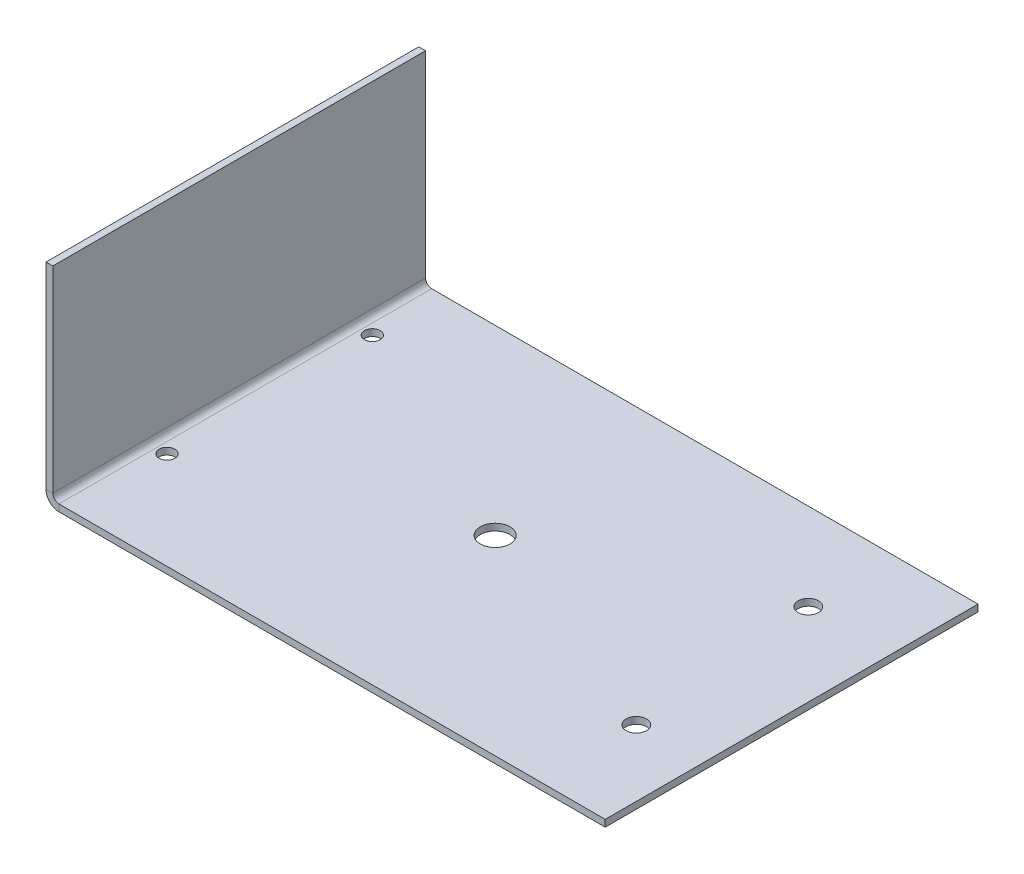
ISO-10303-21;
HEADER;
FILE_DESCRIPTION(('STEP AP214'),'2;1');
FILE_NAME('part.step','',(''),(''),'','','');
FILE_SCHEMA(('AUTOMOTIVE_DESIGN { 1 0 10303 214 1 1 1 1 }'));
ENDSEC;
DATA;
#1=APPLICATION_CONTEXT('core data for automotive mechanical design processes');
#2=APPLICATION_PROTOCOL_DEFINITION('international standard','automotive_design',2000,#1);
#3=PRODUCT_CONTEXT('',#1,'mechanical');
#4=PRODUCT('Part','Part','',(#3));
#5=PRODUCT_RELATED_PRODUCT_CATEGORY('part','',(#4));
#6=PRODUCT_DEFINITION_FORMATION('','',#4);
#7=PRODUCT_DEFINITION_CONTEXT('part definition',#1,'design');
#8=PRODUCT_DEFINITION('design','',#6,#7);
#9=PRODUCT_DEFINITION_SHAPE('','',#8);
#10=(LENGTH_UNIT() NAMED_UNIT(*) SI_UNIT(.MILLI.,.METRE.));
#11=(NAMED_UNIT(*) PLANE_ANGLE_UNIT() SI_UNIT($,.RADIAN.));
#12=(NAMED_UNIT(*) SI_UNIT($,.STERADIAN.) SOLID_ANGLE_UNIT());
#13=UNCERTAINTY_MEASURE_WITH_UNIT(LENGTH_MEASURE(1.E-05),#10,'distance_accuracy_value','');
#14=(GEOMETRIC_REPRESENTATION_CONTEXT(3) GLOBAL_UNCERTAINTY_ASSIGNED_CONTEXT((#13)) GLOBAL_UNIT_ASSIGNED_CONTEXT((#10,
#11,#12)) REPRESENTATION_CONTEXT('',''));
#15=CARTESIAN_POINT('',(0.,0.,0.));
#16=DIRECTION('',(0.,0.,1.));
#17=DIRECTION('',(1.,0.,0.));
#18=AXIS2_PLACEMENT_3D('',#15,#16,#17);
#19=CARTESIAN_POINT('',(0.,-1.8542,0.));
#20=DIRECTION('',(0.,0.,1.));
#21=DIRECTION('',(1.,0.,0.));
#22=AXIS2_PLACEMENT_3D('',#19,#20,#21);
#23=PLANE('',#22);
#24=DIRECTION('',(1.,0.,0.));
#25=VECTOR('',#24,1.);
#26=CARTESIAN_POINT('',(0.,0.,0.));
#27=LINE('',#26,#25);
#28=CARTESIAN_POINT('',(3.51789999999999,0.,0.));
#29=VERTEX_POINT('',#28);
#30=CARTESIAN_POINT('',(152.4,0.,0.));
#31=VERTEX_POINT('',#30);
#32=EDGE_CURVE('E106',#29,#31,#27,.T.);
#33=ORIENTED_EDGE('',*,*,#32,.F.);
#34=DIRECTION('',(0.,-1.,0.));
#35=VECTOR('',#34,1.);
#36=CARTESIAN_POINT('',(3.51789999999999,0.,0.));
#37=LINE('',#36,#35);
#38=CARTESIAN_POINT('',(3.51789999999999,-1.8542,0.));
#39=VERTEX_POINT('',#38);
#40=EDGE_CURVE('E119',#29,#39,#37,.T.);
#41=ORIENTED_EDGE('',*,*,#40,.T.);
#42=DIRECTION('',(1.,0.,0.));
#43=VECTOR('',#42,1.);
#44=CARTESIAN_POINT('',(0.,-1.8542,0.));
#45=LINE('',#44,#43);
#46=CARTESIAN_POINT('',(152.4,-1.8542,0.));
#47=VERTEX_POINT('',#46);
#48=EDGE_CURVE('E111',#39,#47,#45,.T.);
#49=ORIENTED_EDGE('',*,*,#48,.T.);
#50=DIRECTION('',(0.,1.,0.));
#51=VECTOR('',#50,1.);
#52=CARTESIAN_POINT('',(152.4,-1.8542,0.));
#53=LINE('',#52,#51);
#54=EDGE_CURVE('E61',#47,#31,#53,.T.);
#55=ORIENTED_EDGE('',*,*,#54,.T.);
#56=EDGE_LOOP('',(#33,#41,#49,#55));
#57=FACE_BOUND('',#56,.T.);
#58=ADVANCED_FACE('F58',(#57),#23,.T.);
#59=CARTESIAN_POINT('',(0.,-1.8542,0.));
#60=DIRECTION('',(0.,-1.,0.));
#61=DIRECTION('',(0.,0.,-1.));
#62=AXIS2_PLACEMENT_3D('',#59,#60,#61);
#63=PLANE('',#62);
#64=CARTESIAN_POINT('',(6.38309275548128,-1.8542,-26.5806035807034));
#65=DIRECTION('',(0.,1.,0.));
#66=DIRECTION('',(0.,0.,1.));
#67=AXIS2_PLACEMENT_3D('',#64,#65,#66);
#68=CIRCLE('',#67,2.15265);
#69=CARTESIAN_POINT('',(6.38309275548128,-1.8542,-24.4279535807034));
#70=VERTEX_POINT('',#69);
#71=EDGE_CURVE('E198',#70,#70,#68,.T.);
#72=ORIENTED_EDGE('',*,*,#71,.T.);
#73=EDGE_LOOP('',(#72));
#74=FACE_BOUND('',#73,.T.);
#75=CARTESIAN_POINT('',(6.38840052073655,-1.8542,-82.5513453931502));
#76=DIRECTION('',(0.,1.,0.));
#77=DIRECTION('',(0.,0.,1.));
#78=AXIS2_PLACEMENT_3D('',#75,#76,#77);
#79=CIRCLE('',#78,2.15265);
#80=CARTESIAN_POINT('',(6.38840052073655,-1.8542,-80.3986953931502));
#81=VERTEX_POINT('',#80);
#82=EDGE_CURVE('E192',#81,#81,#79,.T.);
#83=ORIENTED_EDGE('',*,*,#82,.T.);
#84=EDGE_LOOP('',(#83));
#85=FACE_BOUND('',#84,.T.);
#86=CARTESIAN_POINT('',(70.3804471103808,-1.8542,-52.0253258416687));
#87=DIRECTION('',(0.,1.,0.));
#88=DIRECTION('',(0.,0.,1.));
#89=AXIS2_PLACEMENT_3D('',#86,#87,#88);
#90=CIRCLE('',#89,4.05765);
#91=CARTESIAN_POINT('',(70.3804471103808,-1.8542,-47.9676758416688));
#92=VERTEX_POINT('',#91);
#93=EDGE_CURVE('E186',#92,#92,#90,.T.);
#94=ORIENTED_EDGE('',*,*,#93,.T.);
#95=EDGE_LOOP('',(#94));
#96=FACE_BOUND('',#95,.T.);
#97=CARTESIAN_POINT('',(129.878159070358,-1.8542,-77.8709179380144));
#98=DIRECTION('',(0.,1.,0.));
#99=DIRECTION('',(0.,0.,1.));
#100=AXIS2_PLACEMENT_3D('',#97,#98,#99);
#101=CIRCLE('',#100,2.77875999999999);
#102=CARTESIAN_POINT('',(129.878159070358,-1.8542,-75.0921579380144));
#103=VERTEX_POINT('',#102);
#104=EDGE_CURVE('E180',#103,#103,#101,.T.);
#105=ORIENTED_EDGE('',*,*,#104,.T.);
#106=EDGE_LOOP('',(#105));
#107=FACE_BOUND('',#106,.T.);
#108=CARTESIAN_POINT('',(134.322155935024,-1.8542,-26.5607383720408));
#109=DIRECTION('',(0.,1.,0.));
#110=DIRECTION('',(0.,0.,1.));
#111=AXIS2_PLACEMENT_3D('',#108,#109,#110);
#112=CIRCLE('',#111,2.77875999999999);
#113=CARTESIAN_POINT('',(134.322155935024,-1.8542,-23.7819783720408));
#114=VERTEX_POINT('',#113);
#115=EDGE_CURVE('E144',#114,#114,#112,.T.);
#116=ORIENTED_EDGE('',*,*,#115,.T.);
#117=EDGE_LOOP('',(#116));
#118=FACE_BOUND('',#117,.T.);
#119=ORIENTED_EDGE('',*,*,#48,.F.);
#120=DIRECTION('',(0.,0.,1.));
#121=VECTOR('',#120,1.);
#122=CARTESIAN_POINT('',(3.51789999999999,-1.8542,0.));
#123=LINE('',#122,#121);
#124=CARTESIAN_POINT('',(3.51789999999999,-1.8542,-101.6));
#125=VERTEX_POINT('',#124);
#126=EDGE_CURVE('E136',#39,#125,#123,.F.);
#127=ORIENTED_EDGE('',*,*,#126,.T.);
#128=DIRECTION('',(-1.,0.,0.));
#129=VECTOR('',#128,1.);
#130=CARTESIAN_POINT('',(0.,-1.8542,-101.6));
#131=LINE('',#130,#129);
#132=CARTESIAN_POINT('',(152.4,-1.8542,-101.6));
#133=VERTEX_POINT('',#132);
#134=EDGE_CURVE('E116',#133,#125,#131,.T.);
#135=ORIENTED_EDGE('',*,*,#134,.F.);
#136=DIRECTION('',(0.,0.,-1.));
#137=VECTOR('',#136,1.);
#138=CARTESIAN_POINT('',(152.4,-1.8542,0.));
#139=LINE('',#138,#137);
#140=EDGE_CURVE('E96',#47,#133,#139,.T.);
#141=ORIENTED_EDGE('',*,*,#140,.F.);
#142=EDGE_LOOP('',(#119,#127,#135,#141));
#143=FACE_BOUND('',#142,.T.);
#144=ADVANCED_FACE('F209',(#74,#85,#96,#107,#118,#143),#63,.T.);
#145=CARTESIAN_POINT('',(0.,0.,0.));
#146=DIRECTION('',(0.,-1.,0.));
#147=DIRECTION('',(0.,0.,-1.));
#148=AXIS2_PLACEMENT_3D('',#145,#146,#147);
#149=PLANE('',#148);
#150=CARTESIAN_POINT('',(6.38309275548128,0.,-26.5806035807034));
#151=DIRECTION('',(0.,1.,0.));
#152=DIRECTION('',(0.,0.,1.));
#153=AXIS2_PLACEMENT_3D('',#150,#151,#152);
#154=CIRCLE('',#153,2.15265);
#155=CARTESIAN_POINT('',(6.38309275548128,0.,-24.4279535807034));
#156=VERTEX_POINT('',#155);
#157=EDGE_CURVE('E201',#156,#156,#154,.T.);
#158=ORIENTED_EDGE('',*,*,#157,.F.);
#159=EDGE_LOOP('',(#158));
#160=FACE_BOUND('',#159,.T.);
#161=CARTESIAN_POINT('',(6.38840052073655,0.,-82.5513453931502));
#162=DIRECTION('',(0.,1.,0.));
#163=DIRECTION('',(0.,0.,1.));
#164=AXIS2_PLACEMENT_3D('',#161,#162,#163);
#165=CIRCLE('',#164,2.15265);
#166=CARTESIAN_POINT('',(6.38840052073655,0.,-80.3986953931502));
#167=VERTEX_POINT('',#166);
#168=EDGE_CURVE('E195',#167,#167,#165,.T.);
#169=ORIENTED_EDGE('',*,*,#168,.F.);
#170=EDGE_LOOP('',(#169));
#171=FACE_BOUND('',#170,.T.);
#172=CARTESIAN_POINT('',(70.3804471103808,0.,-52.0253258416687));
#173=DIRECTION('',(0.,1.,0.));
#174=DIRECTION('',(0.,0.,1.));
#175=AXIS2_PLACEMENT_3D('',#172,#173,#174);
#176=CIRCLE('',#175,4.05765);
#177=CARTESIAN_POINT('',(70.3804471103808,0.,-47.9676758416688));
#178=VERTEX_POINT('',#177);
#179=EDGE_CURVE('E189',#178,#178,#176,.T.);
#180=ORIENTED_EDGE('',*,*,#179,.F.);
#181=EDGE_LOOP('',(#180));
#182=FACE_BOUND('',#181,.T.);
#183=CARTESIAN_POINT('',(129.878159070358,0.,-77.8709179380144));
#184=DIRECTION('',(0.,1.,0.));
#185=DIRECTION('',(0.,0.,1.));
#186=AXIS2_PLACEMENT_3D('',#183,#184,#185);
#187=CIRCLE('',#186,2.77875999999999);
#188=CARTESIAN_POINT('',(129.878159070358,0.,-75.0921579380144));
#189=VERTEX_POINT('',#188);
#190=EDGE_CURVE('E183',#189,#189,#187,.T.);
#191=ORIENTED_EDGE('',*,*,#190,.F.);
#192=EDGE_LOOP('',(#191));
#193=FACE_BOUND('',#192,.T.);
#194=CARTESIAN_POINT('',(134.322155935024,0.,-26.5607383720408));
#195=DIRECTION('',(0.,1.,0.));
#196=DIRECTION('',(0.,0.,1.));
#197=AXIS2_PLACEMENT_3D('',#194,#195,#196);
#198=CIRCLE('',#197,2.77875999999999);
#199=CARTESIAN_POINT('',(134.322155935024,0.,-23.7819783720408));
#200=VERTEX_POINT('',#199);
#201=EDGE_CURVE('E177',#200,#200,#198,.T.);
#202=ORIENTED_EDGE('',*,*,#201,.F.);
#203=EDGE_LOOP('',(#202));
#204=FACE_BOUND('',#203,.T.);
#205=DIRECTION('',(0.,0.,1.));
#206=VECTOR('',#205,1.);
#207=CARTESIAN_POINT('',(3.51789999999999,0.,0.));
#208=LINE('',#207,#206);
#209=CARTESIAN_POINT('',(3.51789999999999,0.,-101.6));
#210=VERTEX_POINT('',#209);
#211=EDGE_CURVE('E126',#29,#210,#208,.F.);
#212=ORIENTED_EDGE('',*,*,#211,.F.);
#213=ORIENTED_EDGE('',*,*,#32,.T.);
#214=DIRECTION('',(0.,0.,-1.));
#215=VECTOR('',#214,1.);
#216=CARTESIAN_POINT('',(152.4,0.,0.));
#217=LINE('',#216,#215);
#218=CARTESIAN_POINT('',(152.4,0.,-101.6));
#219=VERTEX_POINT('',#218);
#220=EDGE_CURVE('E94',#31,#219,#217,.T.);
#221=ORIENTED_EDGE('',*,*,#220,.T.);
#222=DIRECTION('',(-1.,0.,0.));
#223=VECTOR('',#222,1.);
#224=CARTESIAN_POINT('',(0.,0.,-101.6));
#225=LINE('',#224,#223);
#226=EDGE_CURVE('E103',#219,#210,#225,.T.);
#227=ORIENTED_EDGE('',*,*,#226,.T.);
#228=EDGE_LOOP('',(#212,#213,#221,#227));
#229=FACE_BOUND('',#228,.T.);
#230=ADVANCED_FACE('F101',(#160,#171,#182,#193,#204,#229),#149,.F.);
#231=CARTESIAN_POINT('',(0.,-1.8542,-101.6));
#232=DIRECTION('',(0.,0.,-1.));
#233=DIRECTION('',(-1.,0.,0.));
#234=AXIS2_PLACEMENT_3D('',#231,#232,#233);
#235=PLANE('',#234);
#236=DIRECTION('',(0.,-1.,0.));
#237=VECTOR('',#236,1.);
#238=CARTESIAN_POINT('',(3.51789999999999,0.,-101.6));
#239=LINE('',#238,#237);
#240=EDGE_CURVE('E110',#210,#125,#239,.T.);
#241=ORIENTED_EDGE('',*,*,#240,.F.);
#242=ORIENTED_EDGE('',*,*,#226,.F.);
#243=DIRECTION('',(0.,1.,0.));
#244=VECTOR('',#243,1.);
#245=CARTESIAN_POINT('',(152.4,-1.8542,-101.6));
#246=LINE('',#245,#244);
#247=EDGE_CURVE('E13',#133,#219,#246,.T.);
#248=ORIENTED_EDGE('',*,*,#247,.F.);
#249=ORIENTED_EDGE('',*,*,#134,.T.);
#250=EDGE_LOOP('',(#241,#242,#248,#249));
#251=FACE_BOUND('',#250,.T.);
#252=ADVANCED_FACE('F109',(#251),#235,.T.);
#253=CARTESIAN_POINT('',(152.4,-1.8542,0.));
#254=DIRECTION('',(1.,0.,0.));
#255=DIRECTION('',(0.,0.,-1.));
#256=AXIS2_PLACEMENT_3D('',#253,#254,#255);
#257=PLANE('',#256);
#258=ORIENTED_EDGE('',*,*,#220,.F.);
#259=ORIENTED_EDGE('',*,*,#54,.F.);
#260=ORIENTED_EDGE('',*,*,#140,.T.);
#261=ORIENTED_EDGE('',*,*,#247,.T.);
#262=EDGE_LOOP('',(#258,#259,#260,#261));
#263=FACE_BOUND('',#262,.T.);
#264=ADVANCED_FACE('F92',(#263),#257,.T.);
#265=CARTESIAN_POINT('',(3.51789999999999,1.6637,-101.6));
#266=DIRECTION('',(0.,0.,-1.));
#267=DIRECTION('',(-1.,0.,0.));
#268=AXIS2_PLACEMENT_3D('',#265,#266,#267);
#269=PLANE('',#268);
#270=DIRECTION('',(1.,0.,0.));
#271=VECTOR('',#270,1.);
#272=CARTESIAN_POINT('',(0.,1.66369999999999,-101.6));
#273=LINE('',#272,#271);
#274=CARTESIAN_POINT('',(1.85419999999999,1.66369999999999,-101.6));
#275=VERTEX_POINT('',#274);
#276=CARTESIAN_POINT('',(0.,1.66369999999999,-101.6));
#277=VERTEX_POINT('',#276);
#278=EDGE_CURVE('E140',#275,#277,#273,.F.);
#279=ORIENTED_EDGE('',*,*,#278,.F.);
#280=CARTESIAN_POINT('',(3.51789999999999,1.6637,-101.6));
#281=DIRECTION('',(0.,0.,1.));
#282=DIRECTION('',(1.,0.,0.));
#283=AXIS2_PLACEMENT_3D('',#280,#281,#282);
#284=CIRCLE('',#283,1.6637);
#285=EDGE_CURVE('E130',#210,#275,#284,.F.);
#286=ORIENTED_EDGE('',*,*,#285,.F.);
#287=ORIENTED_EDGE('',*,*,#240,.T.);
#288=CARTESIAN_POINT('',(3.51789999999999,1.6637,-101.6));
#289=DIRECTION('',(0.,0.,1.));
#290=DIRECTION('',(1.,0.,0.));
#291=AXIS2_PLACEMENT_3D('',#288,#289,#290);
#292=CIRCLE('',#291,3.5179);
#293=EDGE_CURVE('E72',#125,#277,#292,.F.);
#294=ORIENTED_EDGE('',*,*,#293,.T.);
#295=EDGE_LOOP('',(#279,#286,#287,#294));
#296=FACE_BOUND('',#295,.T.);
#297=ADVANCED_FACE('F294',(#296),#269,.T.);
#298=CARTESIAN_POINT('',(3.51789999999999,1.6637,0.));
#299=DIRECTION('',(0.,0.,-1.));
#300=DIRECTION('',(-1.,0.,0.));
#301=AXIS2_PLACEMENT_3D('',#298,#299,#300);
#302=PLANE('',#301);
#303=CARTESIAN_POINT('',(3.51789999999999,1.6637,0.));
#304=DIRECTION('',(0.,0.,1.));
#305=DIRECTION('',(1.,0.,0.));
#306=AXIS2_PLACEMENT_3D('',#303,#304,#305);
#307=CIRCLE('',#306,1.6637);
#308=CARTESIAN_POINT('',(1.85419999999999,1.66369999999999,0.));
#309=VERTEX_POINT('',#308);
#310=EDGE_CURVE('E123',#309,#29,#307,.T.);
#311=ORIENTED_EDGE('',*,*,#310,.F.);
#312=DIRECTION('',(1.,0.,0.));
#313=VECTOR('',#312,1.);
#314=CARTESIAN_POINT('',(1.85419999999999,1.66369999999999,0.));
#315=LINE('',#314,#313);
#316=CARTESIAN_POINT('',(0.,1.66369999999999,0.));
#317=VERTEX_POINT('',#316);
#318=EDGE_CURVE('E147',#309,#317,#315,.F.);
#319=ORIENTED_EDGE('',*,*,#318,.T.);
#320=CARTESIAN_POINT('',(3.51789999999999,1.6637,0.));
#321=DIRECTION('',(0.,0.,1.));
#322=DIRECTION('',(1.,0.,0.));
#323=AXIS2_PLACEMENT_3D('',#320,#321,#322);
#324=CIRCLE('',#323,3.5179);
#325=EDGE_CURVE('E133',#317,#39,#324,.T.);
#326=ORIENTED_EDGE('',*,*,#325,.T.);
#327=ORIENTED_EDGE('',*,*,#40,.F.);
#328=EDGE_LOOP('',(#311,#319,#326,#327));
#329=FACE_BOUND('',#328,.T.);
#330=ADVANCED_FACE('F276',(#329),#302,.F.);
#331=CARTESIAN_POINT('',(3.51789999999999,1.6637,0.));
#332=DIRECTION('',(0.,0.,1.));
#333=DIRECTION('',(-1.,0.,0.));
#334=AXIS2_PLACEMENT_3D('',#331,#332,#333);
#335=CYLINDRICAL_SURFACE('',#334,3.5179);
#336=ORIENTED_EDGE('',*,*,#126,.F.);
#337=ORIENTED_EDGE('',*,*,#325,.F.);
#338=DIRECTION('',(0.,0.,1.));
#339=VECTOR('',#338,1.);
#340=CARTESIAN_POINT('',(0.,1.66369999999999,-101.6));
#341=LINE('',#340,#339);
#342=EDGE_CURVE('E150',#317,#277,#341,.F.);
#343=ORIENTED_EDGE('',*,*,#342,.T.);
#344=ORIENTED_EDGE('',*,*,#293,.F.);
#345=EDGE_LOOP('',(#336,#337,#343,#344));
#346=FACE_BOUND('',#345,.T.);
#347=ADVANCED_FACE('F274',(#346),#335,.T.);
#348=CARTESIAN_POINT('',(3.51789999999999,1.6637,0.));
#349=DIRECTION('',(0.,0.,1.));
#350=DIRECTION('',(-1.,0.,0.));
#351=AXIS2_PLACEMENT_3D('',#348,#349,#350);
#352=CYLINDRICAL_SURFACE('',#351,1.6637);
#353=ORIENTED_EDGE('',*,*,#211,.T.);
#354=ORIENTED_EDGE('',*,*,#285,.T.);
#355=DIRECTION('',(0.,0.,1.));
#356=VECTOR('',#355,1.);
#357=CARTESIAN_POINT('',(1.85419999999999,1.66369999999999,-101.6));
#358=LINE('',#357,#356);
#359=EDGE_CURVE('E143',#275,#309,#358,.T.);
#360=ORIENTED_EDGE('',*,*,#359,.T.);
#361=ORIENTED_EDGE('',*,*,#310,.T.);
#362=EDGE_LOOP('',(#353,#354,#360,#361));
#363=FACE_BOUND('',#362,.T.);
#364=ADVANCED_FACE('F293',(#363),#352,.F.);
#365=CARTESIAN_POINT('',(0.,0.,-101.6));
#366=DIRECTION('',(0.,0.,1.));
#367=DIRECTION('',(1.,0.,0.));
#368=AXIS2_PLACEMENT_3D('',#365,#366,#367);
#369=PLANE('',#368);
#370=ORIENTED_EDGE('',*,*,#278,.T.);
#371=DIRECTION('',(0.,-1.,0.));
#372=VECTOR('',#371,1.);
#373=CARTESIAN_POINT('',(0.,0.,-101.6));
#374=LINE('',#373,#372);
#375=CARTESIAN_POINT('',(-1.93197279255412E-13,55.3339,-101.6));
#376=VERTEX_POINT('',#375);
#377=EDGE_CURVE('E161',#376,#277,#374,.T.);
#378=ORIENTED_EDGE('',*,*,#377,.F.);
#379=DIRECTION('',(1.,0.,0.));
#380=VECTOR('',#379,1.);
#381=CARTESIAN_POINT('',(-1.93197279255412E-13,55.3339,-101.6));
#382=LINE('',#381,#380);
#383=CARTESIAN_POINT('',(1.85419999999981,55.3339,-101.6));
#384=VERTEX_POINT('',#383);
#385=EDGE_CURVE('E170',#376,#384,#382,.T.);
#386=ORIENTED_EDGE('',*,*,#385,.T.);
#387=DIRECTION('',(0.,1.,0.));
#388=VECTOR('',#387,1.);
#389=CARTESIAN_POINT('',(1.8542,0.,-101.6));
#390=LINE('',#389,#388);
#391=EDGE_CURVE('E152',#384,#275,#390,.F.);
#392=ORIENTED_EDGE('',*,*,#391,.T.);
#393=EDGE_LOOP('',(#370,#378,#386,#392));
#394=FACE_BOUND('',#393,.T.);
#395=ADVANCED_FACE('F289',(#394),#369,.F.);
#396=CARTESIAN_POINT('',(-1.93204827136917E-13,55.3339,0.));
#397=DIRECTION('',(0.,0.,-1.));
#398=DIRECTION('',(-1.,0.,0.));
#399=AXIS2_PLACEMENT_3D('',#396,#397,#398);
#400=PLANE('',#399);
#401=ORIENTED_EDGE('',*,*,#318,.F.);
#402=DIRECTION('',(0.,-1.,0.));
#403=VECTOR('',#402,1.);
#404=CARTESIAN_POINT('',(1.85419999999981,55.3339,0.));
#405=LINE('',#404,#403);
#406=CARTESIAN_POINT('',(1.85419999999981,55.3339,0.));
#407=VERTEX_POINT('',#406);
#408=EDGE_CURVE('E155',#309,#407,#405,.F.);
#409=ORIENTED_EDGE('',*,*,#408,.T.);
#410=DIRECTION('',(1.,0.,0.));
#411=VECTOR('',#410,1.);
#412=CARTESIAN_POINT('',(-1.93204827136917E-13,55.3339,0.));
#413=LINE('',#412,#411);
#414=CARTESIAN_POINT('',(-1.93197279255412E-13,55.3339,0.));
#415=VERTEX_POINT('',#414);
#416=EDGE_CURVE('E127',#415,#407,#413,.T.);
#417=ORIENTED_EDGE('',*,*,#416,.F.);
#418=DIRECTION('',(0.,1.,0.));
#419=VECTOR('',#418,1.);
#420=CARTESIAN_POINT('',(0.,0.,0.));
#421=LINE('',#420,#419);
#422=EDGE_CURVE('E164',#317,#415,#421,.T.);
#423=ORIENTED_EDGE('',*,*,#422,.F.);
#424=EDGE_LOOP('',(#401,#409,#417,#423));
#425=FACE_BOUND('',#424,.T.);
#426=ADVANCED_FACE('F285',(#425),#400,.F.);
#427=CARTESIAN_POINT('',(0.,0.,0.));
#428=DIRECTION('',(1.,0.,0.));
#429=DIRECTION('',(0.,1.,0.));
#430=AXIS2_PLACEMENT_3D('',#427,#428,#429);
#431=PLANE('',#430);
#432=ORIENTED_EDGE('',*,*,#342,.F.);
#433=ORIENTED_EDGE('',*,*,#422,.T.);
#434=DIRECTION('',(0.,0.,-1.));
#435=VECTOR('',#434,1.);
#436=CARTESIAN_POINT('',(-1.93197279255412E-13,55.3339,0.));
#437=LINE('',#436,#435);
#438=EDGE_CURVE('E167',#415,#376,#437,.T.);
#439=ORIENTED_EDGE('',*,*,#438,.T.);
#440=ORIENTED_EDGE('',*,*,#377,.T.);
#441=EDGE_LOOP('',(#432,#433,#439,#440));
#442=FACE_BOUND('',#441,.T.);
#443=ADVANCED_FACE('F282',(#442),#431,.F.);
#444=CARTESIAN_POINT('',(1.8542,0.,0.));
#445=DIRECTION('',(1.,0.,0.));
#446=DIRECTION('',(0.,1.,0.));
#447=AXIS2_PLACEMENT_3D('',#444,#445,#446);
#448=PLANE('',#447);
#449=ORIENTED_EDGE('',*,*,#408,.F.);
#450=ORIENTED_EDGE('',*,*,#359,.F.);
#451=ORIENTED_EDGE('',*,*,#391,.F.);
#452=DIRECTION('',(0.,0.,1.));
#453=VECTOR('',#452,1.);
#454=CARTESIAN_POINT('',(1.85419999999981,55.3339,-101.6));
#455=LINE('',#454,#453);
#456=EDGE_CURVE('E158',#407,#384,#455,.F.);
#457=ORIENTED_EDGE('',*,*,#456,.F.);
#458=EDGE_LOOP('',(#449,#450,#451,#457));
#459=FACE_BOUND('',#458,.T.);
#460=ADVANCED_FACE('F232',(#459),#448,.T.);
#461=CARTESIAN_POINT('',(-1.93204827136917E-13,55.3339,-101.6));
#462=DIRECTION('',(0.,-1.,0.));
#463=DIRECTION('',(1.,0.,0.));
#464=AXIS2_PLACEMENT_3D('',#461,#462,#463);
#465=PLANE('',#464);
#466=ORIENTED_EDGE('',*,*,#456,.T.);
#467=ORIENTED_EDGE('',*,*,#385,.F.);
#468=ORIENTED_EDGE('',*,*,#438,.F.);
#469=ORIENTED_EDGE('',*,*,#416,.T.);
#470=EDGE_LOOP('',(#466,#467,#468,#469));
#471=FACE_BOUND('',#470,.T.);
#472=ADVANCED_FACE('F222',(#471),#465,.F.);
#473=CARTESIAN_POINT('',(134.322155935024,0.,-26.5607383720408));
#474=DIRECTION('',(0.,1.,0.));
#475=DIRECTION('',(0.,0.,1.));
#476=AXIS2_PLACEMENT_3D('',#473,#474,#475);
#477=CYLINDRICAL_SURFACE('',#476,2.77875999999999);
#478=ORIENTED_EDGE('',*,*,#115,.F.);
#479=EDGE_LOOP('',(#478));
#480=FACE_BOUND('',#479,.T.);
#481=ORIENTED_EDGE('',*,*,#201,.T.);
#482=EDGE_LOOP('',(#481));
#483=FACE_BOUND('',#482,.T.);
#484=ADVANCED_FACE('F219',(#480,#483),#477,.F.);
#485=CARTESIAN_POINT('',(129.878159070358,0.,-77.8709179380144));
#486=DIRECTION('',(0.,1.,0.));
#487=DIRECTION('',(0.,0.,1.));
#488=AXIS2_PLACEMENT_3D('',#485,#486,#487);
#489=CYLINDRICAL_SURFACE('',#488,2.77875999999999);
#490=ORIENTED_EDGE('',*,*,#104,.F.);
#491=EDGE_LOOP('',(#490));
#492=FACE_BOUND('',#491,.T.);
#493=ORIENTED_EDGE('',*,*,#190,.T.);
#494=EDGE_LOOP('',(#493));
#495=FACE_BOUND('',#494,.T.);
#496=ADVANCED_FACE('F221',(#492,#495),#489,.F.);
#497=CARTESIAN_POINT('',(70.3804471103808,0.,-52.0253258416687));
#498=DIRECTION('',(0.,1.,0.));
#499=DIRECTION('',(0.,0.,1.));
#500=AXIS2_PLACEMENT_3D('',#497,#498,#499);
#501=CYLINDRICAL_SURFACE('',#500,4.05765);
#502=ORIENTED_EDGE('',*,*,#93,.F.);
#503=EDGE_LOOP('',(#502));
#504=FACE_BOUND('',#503,.T.);
#505=ORIENTED_EDGE('',*,*,#179,.T.);
#506=EDGE_LOOP('',(#505));
#507=FACE_BOUND('',#506,.T.);
#508=ADVANCED_FACE('F229',(#504,#507),#501,.F.);
#509=CARTESIAN_POINT('',(6.38840052073655,0.,-82.5513453931502));
#510=DIRECTION('',(0.,1.,0.));
#511=DIRECTION('',(0.,0.,1.));
#512=AXIS2_PLACEMENT_3D('',#509,#510,#511);
#513=CYLINDRICAL_SURFACE('',#512,2.15265);
#514=ORIENTED_EDGE('',*,*,#82,.F.);
#515=EDGE_LOOP('',(#514));
#516=FACE_BOUND('',#515,.T.);
#517=ORIENTED_EDGE('',*,*,#168,.T.);
#518=EDGE_LOOP('',(#517));
#519=FACE_BOUND('',#518,.T.);
#520=ADVANCED_FACE('F411',(#516,#519),#513,.F.);
#521=CARTESIAN_POINT('',(6.38309275548128,0.,-26.5806035807034));
#522=DIRECTION('',(0.,1.,0.));
#523=DIRECTION('',(0.,0.,1.));
#524=AXIS2_PLACEMENT_3D('',#521,#522,#523);
#525=CYLINDRICAL_SURFACE('',#524,2.15265);
#526=ORIENTED_EDGE('',*,*,#71,.F.);
#527=EDGE_LOOP('',(#526));
#528=FACE_BOUND('',#527,.T.);
#529=ORIENTED_EDGE('',*,*,#157,.T.);
#530=EDGE_LOOP('',(#529));
#531=FACE_BOUND('',#530,.T.);
#532=ADVANCED_FACE('F205',(#528,#531),#525,.F.);
#533=CLOSED_SHELL('',(#58,#144,#230,#252,#264,#297,#330,#347,#364,#395,#426,#443,#460,#472,#484,
#496,#508,#520,#532));
#534=MANIFOLD_SOLID_BREP('B2',#533);
#535=ADVANCED_BREP_SHAPE_REPRESENTATION('',(#18,#534),#14);
#536=SHAPE_DEFINITION_REPRESENTATION(#9,#535);
ENDSEC;
END-ISO-10303-21;
